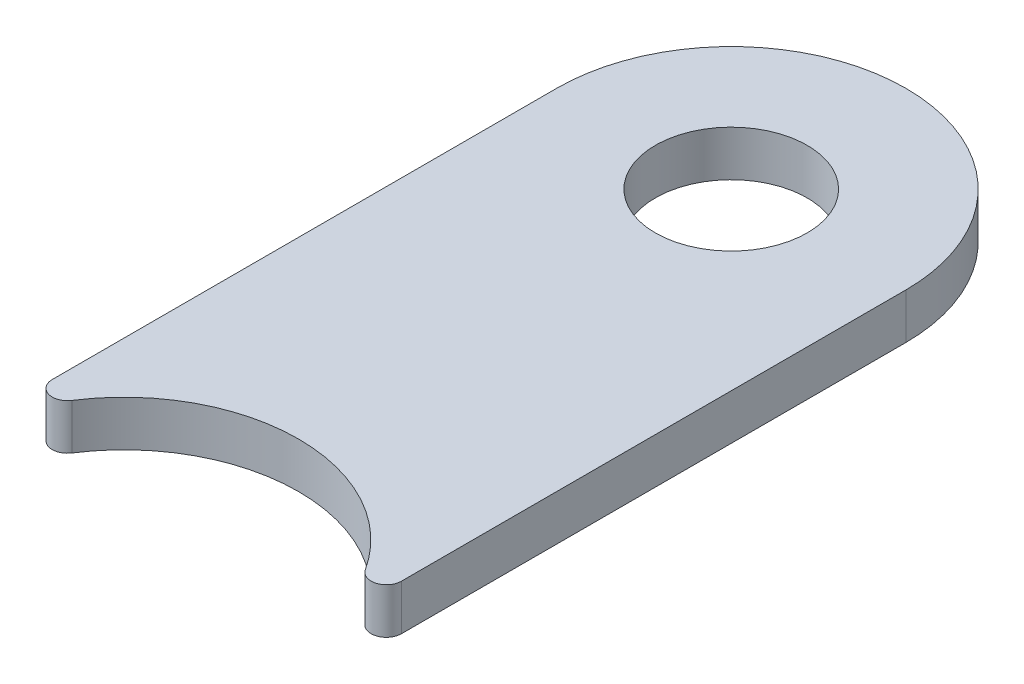
ISO-10303-21;
HEADER;
FILE_DESCRIPTION(('STEP AP214'),'2;1');
FILE_NAME('part.step','',(''),(''),'','','');
FILE_SCHEMA(('AUTOMOTIVE_DESIGN { 1 0 10303 214 1 1 1 1 }'));
ENDSEC;
DATA;
#1=APPLICATION_CONTEXT('core data for automotive mechanical design processes');
#2=APPLICATION_PROTOCOL_DEFINITION('international standard','automotive_design',2000,#1);
#3=PRODUCT_CONTEXT('',#1,'mechanical');
#4=PRODUCT('Part','Part','',(#3));
#5=PRODUCT_RELATED_PRODUCT_CATEGORY('part','',(#4));
#6=PRODUCT_DEFINITION_FORMATION('','',#4);
#7=PRODUCT_DEFINITION_CONTEXT('part definition',#1,'design');
#8=PRODUCT_DEFINITION('design','',#6,#7);
#9=PRODUCT_DEFINITION_SHAPE('','',#8);
#10=(LENGTH_UNIT() NAMED_UNIT(*) SI_UNIT(.MILLI.,.METRE.));
#11=(NAMED_UNIT(*) PLANE_ANGLE_UNIT() SI_UNIT($,.RADIAN.));
#12=(NAMED_UNIT(*) SI_UNIT($,.STERADIAN.) SOLID_ANGLE_UNIT());
#13=UNCERTAINTY_MEASURE_WITH_UNIT(LENGTH_MEASURE(1.E-05),#10,'distance_accuracy_value','');
#14=(GEOMETRIC_REPRESENTATION_CONTEXT(3) GLOBAL_UNCERTAINTY_ASSIGNED_CONTEXT((#13)) GLOBAL_UNIT_ASSIGNED_CONTEXT((#10,
#11,#12)) REPRESENTATION_CONTEXT('',''));
#15=CARTESIAN_POINT('',(0.,0.,0.));
#16=DIRECTION('',(0.,0.,1.));
#17=DIRECTION('',(1.,0.,0.));
#18=AXIS2_PLACEMENT_3D('',#15,#16,#17);
#19=CARTESIAN_POINT('',(11.5,3.,0.));
#20=DIRECTION('',(1.,0.,0.));
#21=DIRECTION('',(0.,0.,-1.));
#22=AXIS2_PLACEMENT_3D('',#19,#20,#21);
#23=PLANE('',#22);
#24=DIRECTION('',(0.,0.,1.));
#25=VECTOR('',#24,1.);
#26=CARTESIAN_POINT('',(11.5,3.,0.));
#27=LINE('',#26,#25);
#28=CARTESIAN_POINT('',(11.5,3.,-40.));
#29=VERTEX_POINT('',#28);
#30=CARTESIAN_POINT('',(11.5,3.,-6.78232998312527));
#31=VERTEX_POINT('',#30);
#32=EDGE_CURVE('E94',#29,#31,#27,.T.);
#33=ORIENTED_EDGE('',*,*,#32,.T.);
#34=DIRECTION('',(0.,-1.,0.));
#35=VECTOR('',#34,1.);
#36=CARTESIAN_POINT('',(11.5,3.,-6.78232998312527));
#37=LINE('',#36,#35);
#38=CARTESIAN_POINT('',(11.5,0.,-6.78232998312527));
#39=VERTEX_POINT('',#38);
#40=EDGE_CURVE('E11',#31,#39,#37,.T.);
#41=ORIENTED_EDGE('',*,*,#40,.T.);
#42=DIRECTION('',(0.,0.,1.));
#43=VECTOR('',#42,1.);
#44=CARTESIAN_POINT('',(11.5,0.,0.));
#45=LINE('',#44,#43);
#46=CARTESIAN_POINT('',(11.5,0.,-40.));
#47=VERTEX_POINT('',#46);
#48=EDGE_CURVE('E97',#47,#39,#45,.T.);
#49=ORIENTED_EDGE('',*,*,#48,.F.);
#50=DIRECTION('',(0.,-1.,0.));
#51=VECTOR('',#50,1.);
#52=CARTESIAN_POINT('',(11.5,3.,-40.));
#53=LINE('',#52,#51);
#54=EDGE_CURVE('E92',#29,#47,#53,.T.);
#55=ORIENTED_EDGE('',*,*,#54,.F.);
#56=EDGE_LOOP('',(#33,#41,#49,#55));
#57=FACE_BOUND('',#56,.T.);
#58=ADVANCED_FACE('F36',(#57),#23,.T.);
#59=CARTESIAN_POINT('',(0.,3.,-40.));
#60=DIRECTION('',(0.,-1.,0.));
#61=DIRECTION('',(0.,0.,-1.));
#62=AXIS2_PLACEMENT_3D('',#59,#60,#61);
#63=CYLINDRICAL_SURFACE('',#62,11.5);
#64=CARTESIAN_POINT('',(0.,0.,-40.));
#65=DIRECTION('',(0.,1.,0.));
#66=DIRECTION('',(0.,0.,1.));
#67=AXIS2_PLACEMENT_3D('',#64,#65,#66);
#68=CIRCLE('',#67,11.5);
#69=CARTESIAN_POINT('',(-11.5,0.,-40.));
#70=VERTEX_POINT('',#69);
#71=EDGE_CURVE('E125',#47,#70,#68,.T.);
#72=ORIENTED_EDGE('',*,*,#71,.T.);
#73=DIRECTION('',(0.,-1.,0.));
#74=VECTOR('',#73,1.);
#75=CARTESIAN_POINT('',(-11.5,3.,-40.));
#76=LINE('',#75,#74);
#77=CARTESIAN_POINT('',(-11.5,3.,-40.));
#78=VERTEX_POINT('',#77);
#79=EDGE_CURVE('E101',#78,#70,#76,.T.);
#80=ORIENTED_EDGE('',*,*,#79,.F.);
#81=CARTESIAN_POINT('',(0.,3.,-40.));
#82=DIRECTION('',(0.,1.,0.));
#83=DIRECTION('',(0.,0.,1.));
#84=AXIS2_PLACEMENT_3D('',#81,#82,#83);
#85=CIRCLE('',#84,11.5);
#86=EDGE_CURVE('E104',#29,#78,#85,.T.);
#87=ORIENTED_EDGE('',*,*,#86,.F.);
#88=ORIENTED_EDGE('',*,*,#54,.T.);
#89=EDGE_LOOP('',(#72,#80,#87,#88));
#90=FACE_BOUND('',#89,.T.);
#91=ADVANCED_FACE('F105',(#90),#63,.T.);
#92=CARTESIAN_POINT('',(-11.5,3.,0.));
#93=DIRECTION('',(1.,0.,0.));
#94=DIRECTION('',(0.,0.,-1.));
#95=AXIS2_PLACEMENT_3D('',#92,#93,#94);
#96=PLANE('',#95);
#97=DIRECTION('',(0.,0.,1.));
#98=VECTOR('',#97,1.);
#99=CARTESIAN_POINT('',(-11.5,0.,0.));
#100=LINE('',#99,#98);
#101=CARTESIAN_POINT('',(-11.5,0.,-6.78232998312527));
#102=VERTEX_POINT('',#101);
#103=EDGE_CURVE('E127',#70,#102,#100,.T.);
#104=ORIENTED_EDGE('',*,*,#103,.T.);
#105=DIRECTION('',(0.,1.,0.));
#106=VECTOR('',#105,1.);
#107=CARTESIAN_POINT('',(-11.5,3.,-6.78232998312527));
#108=LINE('',#107,#106);
#109=CARTESIAN_POINT('',(-11.5,3.,-6.78232998312527));
#110=VERTEX_POINT('',#109);
#111=EDGE_CURVE('E59',#102,#110,#108,.T.);
#112=ORIENTED_EDGE('',*,*,#111,.T.);
#113=DIRECTION('',(0.,0.,1.));
#114=VECTOR('',#113,1.);
#115=CARTESIAN_POINT('',(-11.5,3.,0.));
#116=LINE('',#115,#114);
#117=EDGE_CURVE('E107',#78,#110,#116,.T.);
#118=ORIENTED_EDGE('',*,*,#117,.F.);
#119=ORIENTED_EDGE('',*,*,#79,.T.);
#120=EDGE_LOOP('',(#104,#112,#118,#119));
#121=FACE_BOUND('',#120,.T.);
#122=ADVANCED_FACE('F153',(#121),#96,.F.);
#123=CARTESIAN_POINT('',(0.,3.,0.));
#124=DIRECTION('',(0.,-1.,0.));
#125=DIRECTION('',(0.,0.,-1.));
#126=AXIS2_PLACEMENT_3D('',#123,#124,#125);
#127=CYLINDRICAL_SURFACE('',#126,11.5);
#128=CARTESIAN_POINT('',(0.,3.,0.));
#129=DIRECTION('',(0.,1.,0.));
#130=DIRECTION('',(0.,0.,1.));
#131=AXIS2_PLACEMENT_3D('',#128,#129,#130);
#132=CIRCLE('',#131,11.5);
#133=CARTESIAN_POINT('',(9.66,3.,-6.23974358447525));
#134=VERTEX_POINT('',#133);
#135=CARTESIAN_POINT('',(-9.66,3.,-6.23974358447525));
#136=VERTEX_POINT('',#135);
#137=EDGE_CURVE('E118',#134,#136,#132,.T.);
#138=ORIENTED_EDGE('',*,*,#137,.T.);
#139=DIRECTION('',(0.,-1.,0.));
#140=VECTOR('',#139,1.);
#141=CARTESIAN_POINT('',(-9.66,3.,-6.23974358447525));
#142=LINE('',#141,#140);
#143=CARTESIAN_POINT('',(-9.66,0.,-6.23974358447525));
#144=VERTEX_POINT('',#143);
#145=EDGE_CURVE('E133',#136,#144,#142,.T.);
#146=ORIENTED_EDGE('',*,*,#145,.T.);
#147=CARTESIAN_POINT('',(0.,0.,0.));
#148=DIRECTION('',(0.,1.,0.));
#149=DIRECTION('',(0.,0.,1.));
#150=AXIS2_PLACEMENT_3D('',#147,#148,#149);
#151=CIRCLE('',#150,11.5);
#152=CARTESIAN_POINT('',(9.66,0.,-6.23974358447525));
#153=VERTEX_POINT('',#152);
#154=EDGE_CURVE('E114',#153,#144,#151,.T.);
#155=ORIENTED_EDGE('',*,*,#154,.F.);
#156=DIRECTION('',(0.,-1.,0.));
#157=VECTOR('',#156,1.);
#158=CARTESIAN_POINT('',(9.66,3.,-6.23974358447525));
#159=LINE('',#158,#157);
#160=EDGE_CURVE('E100',#153,#134,#159,.F.);
#161=ORIENTED_EDGE('',*,*,#160,.T.);
#162=EDGE_LOOP('',(#138,#146,#155,#161));
#163=FACE_BOUND('',#162,.T.);
#164=ADVANCED_FACE('F145',(#163),#127,.F.);
#165=CARTESIAN_POINT('',(0.,3.,-40.));
#166=DIRECTION('',(0.,-1.,0.));
#167=DIRECTION('',(0.,0.,-1.));
#168=AXIS2_PLACEMENT_3D('',#165,#166,#167);
#169=CYLINDRICAL_SURFACE('',#168,5.);
#170=CARTESIAN_POINT('',(0.,3.,-40.));
#171=DIRECTION('',(0.,1.,0.));
#172=DIRECTION('',(0.,0.,1.));
#173=AXIS2_PLACEMENT_3D('',#170,#171,#172);
#174=CIRCLE('',#173,5.);
#175=CARTESIAN_POINT('',(0.,3.,-35.));
#176=VERTEX_POINT('',#175);
#177=EDGE_CURVE('E121',#176,#176,#174,.T.);
#178=ORIENTED_EDGE('',*,*,#177,.T.);
#179=EDGE_LOOP('',(#178));
#180=FACE_BOUND('',#179,.T.);
#181=CARTESIAN_POINT('',(0.,0.,-40.));
#182=DIRECTION('',(0.,1.,0.));
#183=DIRECTION('',(0.,0.,1.));
#184=AXIS2_PLACEMENT_3D('',#181,#182,#183);
#185=CIRCLE('',#184,5.);
#186=CARTESIAN_POINT('',(0.,0.,-35.));
#187=VERTEX_POINT('',#186);
#188=EDGE_CURVE('E111',#187,#187,#185,.T.);
#189=ORIENTED_EDGE('',*,*,#188,.F.);
#190=EDGE_LOOP('',(#189));
#191=FACE_BOUND('',#190,.T.);
#192=ADVANCED_FACE('F160',(#180,#191),#169,.F.);
#193=CARTESIAN_POINT('',(0.,3.,0.));
#194=DIRECTION('',(0.,1.,0.));
#195=DIRECTION('',(0.,0.,1.));
#196=AXIS2_PLACEMENT_3D('',#193,#194,#195);
#197=PLANE('',#196);
#198=ORIENTED_EDGE('',*,*,#117,.T.);
#199=CARTESIAN_POINT('',(-10.5,3.,-6.78232998312527));
#200=DIRECTION('',(0.,1.,0.));
#201=DIRECTION('',(0.,0.,1.));
#202=AXIS2_PLACEMENT_3D('',#199,#200,#201);
#203=CIRCLE('',#202,1.);
#204=EDGE_CURVE('E44',#110,#136,#203,.T.);
#205=ORIENTED_EDGE('',*,*,#204,.T.);
#206=ORIENTED_EDGE('',*,*,#137,.F.);
#207=CARTESIAN_POINT('',(10.5,3.,-6.78232998312527));
#208=DIRECTION('',(0.,1.,0.));
#209=DIRECTION('',(0.,0.,1.));
#210=AXIS2_PLACEMENT_3D('',#207,#208,#209);
#211=CIRCLE('',#210,1.);
#212=EDGE_CURVE('E51',#134,#31,#211,.T.);
#213=ORIENTED_EDGE('',*,*,#212,.T.);
#214=ORIENTED_EDGE('',*,*,#32,.F.);
#215=ORIENTED_EDGE('',*,*,#86,.T.);
#216=EDGE_LOOP('',(#198,#205,#206,#213,#214,#215));
#217=FACE_BOUND('',#216,.T.);
#218=ORIENTED_EDGE('',*,*,#177,.F.);
#219=EDGE_LOOP('',(#218));
#220=FACE_BOUND('',#219,.T.);
#221=ADVANCED_FACE('F109',(#217,#220),#197,.T.);
#222=CARTESIAN_POINT('',(0.,0.,0.));
#223=DIRECTION('',(0.,1.,0.));
#224=DIRECTION('',(0.,0.,1.));
#225=AXIS2_PLACEMENT_3D('',#222,#223,#224);
#226=PLANE('',#225);
#227=ORIENTED_EDGE('',*,*,#154,.T.);
#228=CARTESIAN_POINT('',(-10.5,0.,-6.78232998312527));
#229=DIRECTION('',(0.,1.,0.));
#230=DIRECTION('',(0.,0.,1.));
#231=AXIS2_PLACEMENT_3D('',#228,#229,#230);
#232=CIRCLE('',#231,1.);
#233=EDGE_CURVE('E138',#144,#102,#232,.F.);
#234=ORIENTED_EDGE('',*,*,#233,.T.);
#235=ORIENTED_EDGE('',*,*,#103,.F.);
#236=ORIENTED_EDGE('',*,*,#71,.F.);
#237=ORIENTED_EDGE('',*,*,#48,.T.);
#238=CARTESIAN_POINT('',(10.5,0.,-6.78232998312527));
#239=DIRECTION('',(0.,1.,0.));
#240=DIRECTION('',(0.,0.,1.));
#241=AXIS2_PLACEMENT_3D('',#238,#239,#240);
#242=CIRCLE('',#241,1.);
#243=EDGE_CURVE('E136',#39,#153,#242,.F.);
#244=ORIENTED_EDGE('',*,*,#243,.T.);
#245=EDGE_LOOP('',(#227,#234,#235,#236,#237,#244));
#246=FACE_BOUND('',#245,.T.);
#247=ORIENTED_EDGE('',*,*,#188,.T.);
#248=EDGE_LOOP('',(#247));
#249=FACE_BOUND('',#248,.T.);
#250=ADVANCED_FACE('F151',(#246,#249),#226,.F.);
#251=CARTESIAN_POINT('',(-10.5,3.,-6.78232998312527));
#252=DIRECTION('',(0.,-1.,0.));
#253=DIRECTION('',(0.,0.,-1.));
#254=AXIS2_PLACEMENT_3D('',#251,#252,#253);
#255=CYLINDRICAL_SURFACE('',#254,1.);
#256=ORIENTED_EDGE('',*,*,#204,.F.);
#257=ORIENTED_EDGE('',*,*,#111,.F.);
#258=ORIENTED_EDGE('',*,*,#233,.F.);
#259=ORIENTED_EDGE('',*,*,#145,.F.);
#260=EDGE_LOOP('',(#256,#257,#258,#259));
#261=FACE_BOUND('',#260,.T.);
#262=ADVANCED_FACE('F148',(#261),#255,.T.);
#263=CARTESIAN_POINT('',(10.5,3.,-6.78232998312527));
#264=DIRECTION('',(0.,-1.,0.));
#265=DIRECTION('',(0.,0.,-1.));
#266=AXIS2_PLACEMENT_3D('',#263,#264,#265);
#267=CYLINDRICAL_SURFACE('',#266,1.);
#268=ORIENTED_EDGE('',*,*,#212,.F.);
#269=ORIENTED_EDGE('',*,*,#160,.F.);
#270=ORIENTED_EDGE('',*,*,#243,.F.);
#271=ORIENTED_EDGE('',*,*,#40,.F.);
#272=EDGE_LOOP('',(#268,#269,#270,#271));
#273=FACE_BOUND('',#272,.T.);
#274=ADVANCED_FACE('F38',(#273),#267,.T.);
#275=CLOSED_SHELL('',(#58,#91,#122,#164,#192,#221,#250,#262,#274));
#276=MANIFOLD_SOLID_BREP('B2',#275);
#277=ADVANCED_BREP_SHAPE_REPRESENTATION('',(#18,#276),#14);
#278=SHAPE_DEFINITION_REPRESENTATION(#9,#277);
ENDSEC;
END-ISO-10303-21;
